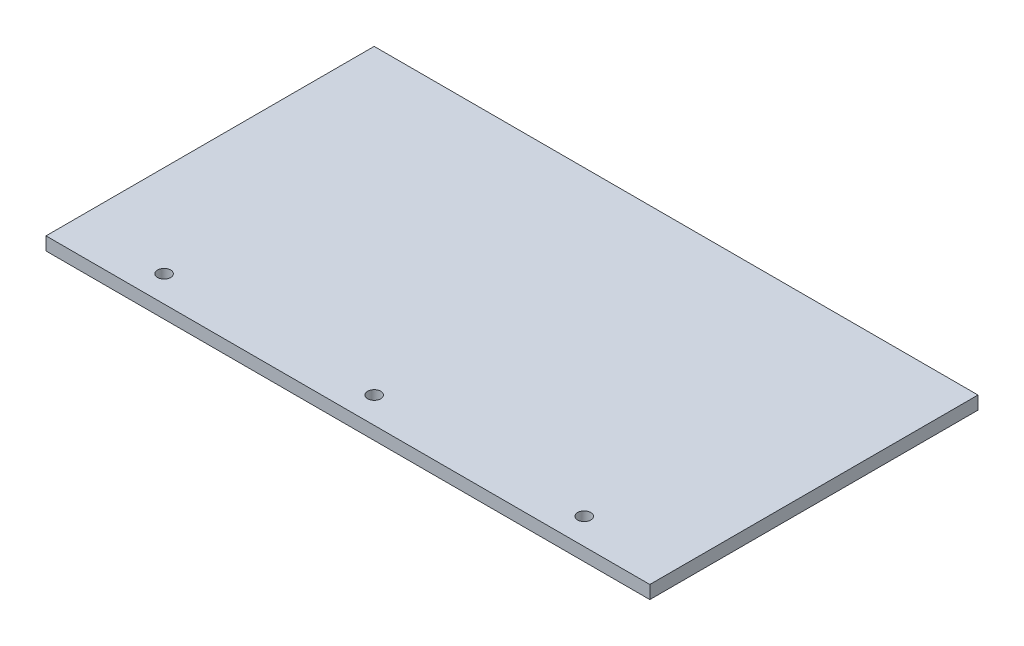
ISO-10303-21;
HEADER;
FILE_DESCRIPTION(('STEP AP214'),'2;1');
FILE_NAME('part.step','',(''),(''),'','','');
FILE_SCHEMA(('AUTOMOTIVE_DESIGN { 1 0 10303 214 1 1 1 1 }'));
ENDSEC;
DATA;
#1=APPLICATION_CONTEXT('core data for automotive mechanical design processes');
#2=APPLICATION_PROTOCOL_DEFINITION('international standard','automotive_design',2000,#1);
#3=PRODUCT_CONTEXT('',#1,'mechanical');
#4=PRODUCT('Part','Part','',(#3));
#5=PRODUCT_RELATED_PRODUCT_CATEGORY('part','',(#4));
#6=PRODUCT_DEFINITION_FORMATION('','',#4);
#7=PRODUCT_DEFINITION_CONTEXT('part definition',#1,'design');
#8=PRODUCT_DEFINITION('design','',#6,#7);
#9=PRODUCT_DEFINITION_SHAPE('','',#8);
#10=(LENGTH_UNIT() NAMED_UNIT(*) SI_UNIT(.MILLI.,.METRE.));
#11=(NAMED_UNIT(*) PLANE_ANGLE_UNIT() SI_UNIT($,.RADIAN.));
#12=(NAMED_UNIT(*) SI_UNIT($,.STERADIAN.) SOLID_ANGLE_UNIT());
#13=UNCERTAINTY_MEASURE_WITH_UNIT(LENGTH_MEASURE(1.E-05),#10,'distance_accuracy_value','');
#14=(GEOMETRIC_REPRESENTATION_CONTEXT(3) GLOBAL_UNCERTAINTY_ASSIGNED_CONTEXT((#13)) GLOBAL_UNIT_ASSIGNED_CONTEXT((#10,
#11,#12)) REPRESENTATION_CONTEXT('',''));
#15=CARTESIAN_POINT('',(0.,0.,0.));
#16=DIRECTION('',(0.,0.,1.));
#17=DIRECTION('',(1.,0.,0.));
#18=AXIS2_PLACEMENT_3D('',#15,#16,#17);
#19=CARTESIAN_POINT('',(0.,6.35,0.));
#20=DIRECTION('',(1.,0.,0.));
#21=DIRECTION('',(0.,0.,-1.));
#22=AXIS2_PLACEMENT_3D('',#19,#20,#21);
#23=PLANE('',#22);
#24=DIRECTION('',(0.,0.,1.));
#25=VECTOR('',#24,1.);
#26=CARTESIAN_POINT('',(0.,0.,0.));
#27=LINE('',#26,#25);
#28=CARTESIAN_POINT('',(0.,0.,-158.75));
#29=VERTEX_POINT('',#28);
#30=CARTESIAN_POINT('',(0.,0.,0.));
#31=VERTEX_POINT('',#30);
#32=EDGE_CURVE('E97',#29,#31,#27,.T.);
#33=ORIENTED_EDGE('',*,*,#32,.T.);
#34=DIRECTION('',(0.,-1.,0.));
#35=VECTOR('',#34,1.);
#36=CARTESIAN_POINT('',(0.,6.35,0.));
#37=LINE('',#36,#35);
#38=CARTESIAN_POINT('',(0.,6.35,0.));
#39=VERTEX_POINT('',#38);
#40=EDGE_CURVE('E11',#39,#31,#37,.T.);
#41=ORIENTED_EDGE('',*,*,#40,.F.);
#42=DIRECTION('',(0.,0.,1.));
#43=VECTOR('',#42,1.);
#44=CARTESIAN_POINT('',(0.,6.35,0.));
#45=LINE('',#44,#43);
#46=CARTESIAN_POINT('',(0.,6.35,-158.75));
#47=VERTEX_POINT('',#46);
#48=EDGE_CURVE('E85',#47,#39,#45,.T.);
#49=ORIENTED_EDGE('',*,*,#48,.F.);
#50=DIRECTION('',(0.,-1.,0.));
#51=VECTOR('',#50,1.);
#52=CARTESIAN_POINT('',(0.,6.35,-158.75));
#53=LINE('',#52,#51);
#54=EDGE_CURVE('E93',#47,#29,#53,.T.);
#55=ORIENTED_EDGE('',*,*,#54,.T.);
#56=EDGE_LOOP('',(#33,#41,#49,#55));
#57=FACE_BOUND('',#56,.T.);
#58=ADVANCED_FACE('F34',(#57),#23,.F.);
#59=CARTESIAN_POINT('',(0.,6.35,0.));
#60=DIRECTION('',(0.,0.,-1.));
#61=DIRECTION('',(-1.,0.,0.));
#62=AXIS2_PLACEMENT_3D('',#59,#60,#61);
#63=PLANE('',#62);
#64=DIRECTION('',(1.,0.,0.));
#65=VECTOR('',#64,1.);
#66=CARTESIAN_POINT('',(0.,0.,0.));
#67=LINE('',#66,#65);
#68=CARTESIAN_POINT('',(292.1,0.,0.));
#69=VERTEX_POINT('',#68);
#70=EDGE_CURVE('E89',#31,#69,#67,.T.);
#71=ORIENTED_EDGE('',*,*,#70,.T.);
#72=DIRECTION('',(0.,-1.,0.));
#73=VECTOR('',#72,1.);
#74=CARTESIAN_POINT('',(292.1,6.35,0.));
#75=LINE('',#74,#73);
#76=CARTESIAN_POINT('',(292.1,6.35,0.));
#77=VERTEX_POINT('',#76);
#78=EDGE_CURVE('E42',#77,#69,#75,.T.);
#79=ORIENTED_EDGE('',*,*,#78,.F.);
#80=DIRECTION('',(1.,0.,0.));
#81=VECTOR('',#80,1.);
#82=CARTESIAN_POINT('',(0.,6.35,0.));
#83=LINE('',#82,#81);
#84=EDGE_CURVE('E80',#39,#77,#83,.T.);
#85=ORIENTED_EDGE('',*,*,#84,.F.);
#86=ORIENTED_EDGE('',*,*,#40,.T.);
#87=EDGE_LOOP('',(#71,#79,#85,#86));
#88=FACE_BOUND('',#87,.T.);
#89=ADVANCED_FACE('F88',(#88),#63,.F.);
#90=CARTESIAN_POINT('',(292.1,6.35,0.));
#91=DIRECTION('',(-1.,0.,0.));
#92=DIRECTION('',(0.,0.,1.));
#93=AXIS2_PLACEMENT_3D('',#90,#91,#92);
#94=PLANE('',#93);
#95=DIRECTION('',(0.,0.,-1.));
#96=VECTOR('',#95,1.);
#97=CARTESIAN_POINT('',(292.1,0.,0.));
#98=LINE('',#97,#96);
#99=CARTESIAN_POINT('',(292.1,0.,-158.75));
#100=VERTEX_POINT('',#99);
#101=EDGE_CURVE('E67',#69,#100,#98,.T.);
#102=ORIENTED_EDGE('',*,*,#101,.T.);
#103=DIRECTION('',(0.,-1.,0.));
#104=VECTOR('',#103,1.);
#105=CARTESIAN_POINT('',(292.1,6.35,-158.75));
#106=LINE('',#105,#104);
#107=CARTESIAN_POINT('',(292.1,6.35,-158.75));
#108=VERTEX_POINT('',#107);
#109=EDGE_CURVE('E90',#108,#100,#106,.T.);
#110=ORIENTED_EDGE('',*,*,#109,.F.);
#111=DIRECTION('',(0.,0.,-1.));
#112=VECTOR('',#111,1.);
#113=CARTESIAN_POINT('',(292.1,6.35,0.));
#114=LINE('',#113,#112);
#115=EDGE_CURVE('E83',#77,#108,#114,.T.);
#116=ORIENTED_EDGE('',*,*,#115,.F.);
#117=ORIENTED_EDGE('',*,*,#78,.T.);
#118=EDGE_LOOP('',(#102,#110,#116,#117));
#119=FACE_BOUND('',#118,.T.);
#120=ADVANCED_FACE('F91',(#119),#94,.F.);
#121=CARTESIAN_POINT('',(0.,6.35,-158.75));
#122=DIRECTION('',(0.,0.,1.));
#123=DIRECTION('',(1.,0.,0.));
#124=AXIS2_PLACEMENT_3D('',#121,#122,#123);
#125=PLANE('',#124);
#126=DIRECTION('',(-1.,0.,0.));
#127=VECTOR('',#126,1.);
#128=CARTESIAN_POINT('',(0.,0.,-158.75));
#129=LINE('',#128,#127);
#130=EDGE_CURVE('E73',#100,#29,#129,.T.);
#131=ORIENTED_EDGE('',*,*,#130,.T.);
#132=ORIENTED_EDGE('',*,*,#54,.F.);
#133=DIRECTION('',(-1.,0.,0.));
#134=VECTOR('',#133,1.);
#135=CARTESIAN_POINT('',(0.,6.35,-158.75));
#136=LINE('',#135,#134);
#137=EDGE_CURVE('E50',#108,#47,#136,.T.);
#138=ORIENTED_EDGE('',*,*,#137,.F.);
#139=ORIENTED_EDGE('',*,*,#109,.T.);
#140=EDGE_LOOP('',(#131,#132,#138,#139));
#141=FACE_BOUND('',#140,.T.);
#142=ADVANCED_FACE('F105',(#141),#125,.F.);
#143=CARTESIAN_POINT('',(0.,6.35,0.));
#144=DIRECTION('',(0.,-1.,0.));
#145=DIRECTION('',(0.,0.,-1.));
#146=AXIS2_PLACEMENT_3D('',#143,#144,#145);
#147=PLANE('',#146);
#148=CARTESIAN_POINT('',(247.65,6.35,-12.7));
#149=DIRECTION('',(0.,1.,0.));
#150=DIRECTION('',(0.,0.,1.));
#151=AXIS2_PLACEMENT_3D('',#148,#149,#150);
#152=CIRCLE('',#151,3.175);
#153=CARTESIAN_POINT('',(247.65,6.35,-9.525));
#154=VERTEX_POINT('',#153);
#155=EDGE_CURVE('E123',#154,#154,#152,.T.);
#156=ORIENTED_EDGE('',*,*,#155,.F.);
#157=EDGE_LOOP('',(#156));
#158=FACE_BOUND('',#157,.T.);
#159=CARTESIAN_POINT('',(44.45,6.35,-12.7));
#160=DIRECTION('',(0.,1.,0.));
#161=DIRECTION('',(0.,0.,1.));
#162=AXIS2_PLACEMENT_3D('',#159,#160,#161);
#163=CIRCLE('',#162,3.175);
#164=CARTESIAN_POINT('',(44.45,6.35,-9.525));
#165=VERTEX_POINT('',#164);
#166=EDGE_CURVE('E117',#165,#165,#163,.T.);
#167=ORIENTED_EDGE('',*,*,#166,.F.);
#168=EDGE_LOOP('',(#167));
#169=FACE_BOUND('',#168,.T.);
#170=CARTESIAN_POINT('',(146.05,6.35,-12.7));
#171=DIRECTION('',(0.,1.,0.));
#172=DIRECTION('',(0.,0.,1.));
#173=AXIS2_PLACEMENT_3D('',#170,#171,#172);
#174=CIRCLE('',#173,3.175);
#175=CARTESIAN_POINT('',(146.05,6.35,-9.525));
#176=VERTEX_POINT('',#175);
#177=EDGE_CURVE('E111',#176,#176,#174,.T.);
#178=ORIENTED_EDGE('',*,*,#177,.F.);
#179=EDGE_LOOP('',(#178));
#180=FACE_BOUND('',#179,.T.);
#181=ORIENTED_EDGE('',*,*,#48,.T.);
#182=ORIENTED_EDGE('',*,*,#84,.T.);
#183=ORIENTED_EDGE('',*,*,#115,.T.);
#184=ORIENTED_EDGE('',*,*,#137,.T.);
#185=EDGE_LOOP('',(#181,#182,#183,#184));
#186=FACE_BOUND('',#185,.T.);
#187=ADVANCED_FACE('F81',(#158,#169,#180,#186),#147,.F.);
#188=CARTESIAN_POINT('',(0.,0.,0.));
#189=DIRECTION('',(0.,-1.,0.));
#190=DIRECTION('',(0.,0.,-1.));
#191=AXIS2_PLACEMENT_3D('',#188,#189,#190);
#192=PLANE('',#191);
#193=CARTESIAN_POINT('',(247.65,0.,-12.7));
#194=DIRECTION('',(0.,1.,0.));
#195=DIRECTION('',(0.,0.,1.));
#196=AXIS2_PLACEMENT_3D('',#193,#194,#195);
#197=CIRCLE('',#196,3.175);
#198=CARTESIAN_POINT('',(247.65,0.,-9.525));
#199=VERTEX_POINT('',#198);
#200=EDGE_CURVE('E114',#199,#199,#197,.T.);
#201=ORIENTED_EDGE('',*,*,#200,.T.);
#202=EDGE_LOOP('',(#201));
#203=FACE_BOUND('',#202,.T.);
#204=CARTESIAN_POINT('',(44.45,0.,-12.7));
#205=DIRECTION('',(0.,1.,0.));
#206=DIRECTION('',(0.,0.,1.));
#207=AXIS2_PLACEMENT_3D('',#204,#205,#206);
#208=CIRCLE('',#207,3.175);
#209=CARTESIAN_POINT('',(44.45,0.,-9.525));
#210=VERTEX_POINT('',#209);
#211=EDGE_CURVE('E120',#210,#210,#208,.T.);
#212=ORIENTED_EDGE('',*,*,#211,.T.);
#213=EDGE_LOOP('',(#212));
#214=FACE_BOUND('',#213,.T.);
#215=CARTESIAN_POINT('',(146.05,0.,-12.7));
#216=DIRECTION('',(0.,1.,0.));
#217=DIRECTION('',(0.,0.,1.));
#218=AXIS2_PLACEMENT_3D('',#215,#216,#217);
#219=CIRCLE('',#218,3.175);
#220=CARTESIAN_POINT('',(146.05,0.,-9.525));
#221=VERTEX_POINT('',#220);
#222=EDGE_CURVE('E100',#221,#221,#219,.T.);
#223=ORIENTED_EDGE('',*,*,#222,.T.);
#224=EDGE_LOOP('',(#223));
#225=FACE_BOUND('',#224,.T.);
#226=ORIENTED_EDGE('',*,*,#32,.F.);
#227=ORIENTED_EDGE('',*,*,#130,.F.);
#228=ORIENTED_EDGE('',*,*,#101,.F.);
#229=ORIENTED_EDGE('',*,*,#70,.F.);
#230=EDGE_LOOP('',(#226,#227,#228,#229));
#231=FACE_BOUND('',#230,.T.);
#232=ADVANCED_FACE('F108',(#203,#214,#225,#231),#192,.T.);
#233=CARTESIAN_POINT('',(146.05,0.,-12.7));
#234=DIRECTION('',(0.,1.,0.));
#235=DIRECTION('',(0.,0.,1.));
#236=AXIS2_PLACEMENT_3D('',#233,#234,#235);
#237=CYLINDRICAL_SURFACE('',#236,3.175);
#238=ORIENTED_EDGE('',*,*,#222,.F.);
#239=EDGE_LOOP('',(#238));
#240=FACE_BOUND('',#239,.T.);
#241=ORIENTED_EDGE('',*,*,#177,.T.);
#242=EDGE_LOOP('',(#241));
#243=FACE_BOUND('',#242,.T.);
#244=ADVANCED_FACE('F145',(#240,#243),#237,.F.);
#245=CARTESIAN_POINT('',(44.45,0.,-12.7));
#246=DIRECTION('',(0.,1.,0.));
#247=DIRECTION('',(0.,0.,1.));
#248=AXIS2_PLACEMENT_3D('',#245,#246,#247);
#249=CYLINDRICAL_SURFACE('',#248,3.175);
#250=ORIENTED_EDGE('',*,*,#211,.F.);
#251=EDGE_LOOP('',(#250));
#252=FACE_BOUND('',#251,.T.);
#253=ORIENTED_EDGE('',*,*,#166,.T.);
#254=EDGE_LOOP('',(#253));
#255=FACE_BOUND('',#254,.T.);
#256=ADVANCED_FACE('F134',(#252,#255),#249,.F.);
#257=CARTESIAN_POINT('',(247.65,0.,-12.7));
#258=DIRECTION('',(0.,1.,0.));
#259=DIRECTION('',(0.,0.,1.));
#260=AXIS2_PLACEMENT_3D('',#257,#258,#259);
#261=CYLINDRICAL_SURFACE('',#260,3.175);
#262=ORIENTED_EDGE('',*,*,#200,.F.);
#263=EDGE_LOOP('',(#262));
#264=FACE_BOUND('',#263,.T.);
#265=ORIENTED_EDGE('',*,*,#155,.T.);
#266=EDGE_LOOP('',(#265));
#267=FACE_BOUND('',#266,.T.);
#268=ADVANCED_FACE('F131',(#264,#267),#261,.F.);
#269=CLOSED_SHELL('',(#58,#89,#120,#142,#187,#232,#244,#256,#268));
#270=MANIFOLD_SOLID_BREP('B2',#269);
#271=ADVANCED_BREP_SHAPE_REPRESENTATION('',(#18,#270),#14);
#272=SHAPE_DEFINITION_REPRESENTATION(#9,#271);
ENDSEC;
END-ISO-10303-21;
